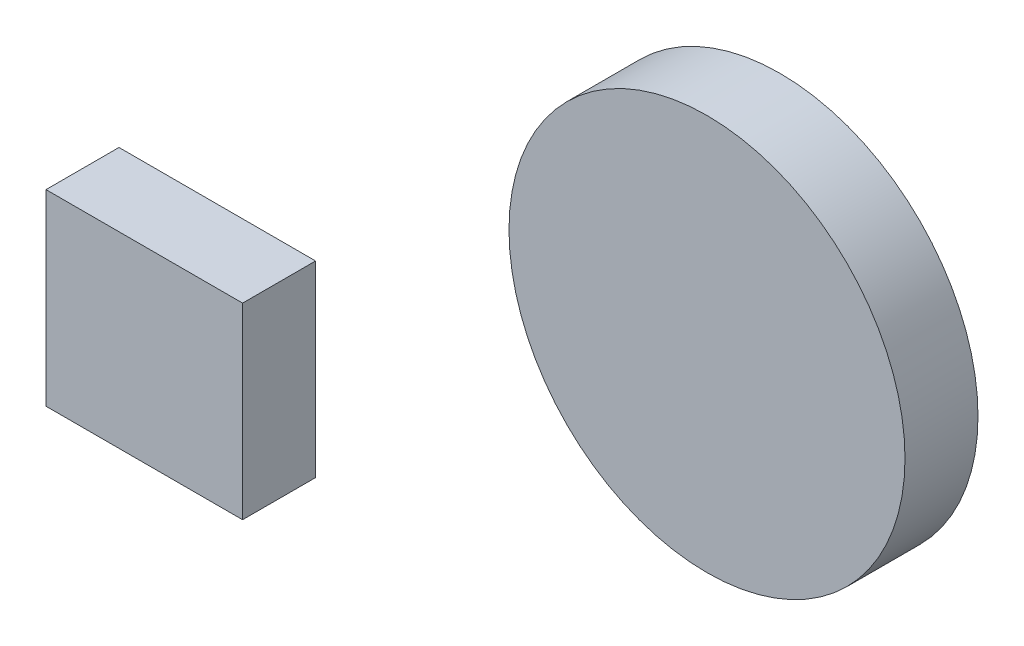
ISO-10303-21;
HEADER;
FILE_DESCRIPTION(('STEP AP214'),'2;1');
FILE_NAME('part.step','',(''),(''),'','','');
FILE_SCHEMA(('AUTOMOTIVE_DESIGN { 1 0 10303 214 1 1 1 1 }'));
ENDSEC;
DATA;
#1=APPLICATION_CONTEXT('core data for automotive mechanical design processes');
#2=APPLICATION_PROTOCOL_DEFINITION('international standard','automotive_design',2000,#1);
#3=PRODUCT_CONTEXT('',#1,'mechanical');
#4=PRODUCT('Part','Part','',(#3));
#5=PRODUCT_RELATED_PRODUCT_CATEGORY('part','',(#4));
#6=PRODUCT_DEFINITION_FORMATION('','',#4);
#7=PRODUCT_DEFINITION_CONTEXT('part definition',#1,'design');
#8=PRODUCT_DEFINITION('design','',#6,#7);
#9=PRODUCT_DEFINITION_SHAPE('','',#8);
#10=(LENGTH_UNIT() NAMED_UNIT(*) SI_UNIT(.MILLI.,.METRE.));
#11=(NAMED_UNIT(*) PLANE_ANGLE_UNIT() SI_UNIT($,.RADIAN.));
#12=(NAMED_UNIT(*) SI_UNIT($,.STERADIAN.) SOLID_ANGLE_UNIT());
#13=UNCERTAINTY_MEASURE_WITH_UNIT(LENGTH_MEASURE(1.E-05),#10,'distance_accuracy_value','');
#14=(GEOMETRIC_REPRESENTATION_CONTEXT(3) GLOBAL_UNCERTAINTY_ASSIGNED_CONTEXT((#13)) GLOBAL_UNIT_ASSIGNED_CONTEXT((#10,
#11,#12)) REPRESENTATION_CONTEXT('',''));
#15=CARTESIAN_POINT('',(0.,0.,0.));
#16=DIRECTION('',(0.,0.,1.));
#17=DIRECTION('',(1.,0.,0.));
#18=AXIS2_PLACEMENT_3D('',#15,#16,#17);
#19=CARTESIAN_POINT('',(-46.2357834757217,17.5092419138344,20.));
#20=DIRECTION('',(1.,0.,0.));
#21=DIRECTION('',(0.,0.,-1.));
#22=AXIS2_PLACEMENT_3D('',#19,#20,#21);
#23=PLANE('',#22);
#24=DIRECTION('',(0.,-1.,0.));
#25=VECTOR('',#24,1.);
#26=CARTESIAN_POINT('',(-46.2357834757217,17.5092419138344,10.));
#27=LINE('',#26,#25);
#28=CARTESIAN_POINT('',(-46.2357834757217,17.5092419138344,10.));
#29=VERTEX_POINT('',#28);
#30=CARTESIAN_POINT('',(-46.2357834757217,-8.19315679848669,10.));
#31=VERTEX_POINT('',#30);
#32=EDGE_CURVE('E110',#29,#31,#27,.T.);
#33=ORIENTED_EDGE('',*,*,#32,.T.);
#34=DIRECTION('',(0.,0.,-1.));
#35=VECTOR('',#34,1.);
#36=CARTESIAN_POINT('',(-46.2357834757217,-8.19315679848669,20.));
#37=LINE('',#36,#35);
#38=CARTESIAN_POINT('',(-46.2357834757217,-8.19315679848669,20.));
#39=VERTEX_POINT('',#38);
#40=EDGE_CURVE('E12',#39,#31,#37,.T.);
#41=ORIENTED_EDGE('',*,*,#40,.F.);
#42=DIRECTION('',(0.,-1.,0.));
#43=VECTOR('',#42,1.);
#44=CARTESIAN_POINT('',(-46.2357834757217,17.5092419138344,20.));
#45=LINE('',#44,#43);
#46=CARTESIAN_POINT('',(-46.2357834757217,17.5092419138344,20.));
#47=VERTEX_POINT('',#46);
#48=EDGE_CURVE('E98',#47,#39,#45,.T.);
#49=ORIENTED_EDGE('',*,*,#48,.F.);
#50=DIRECTION('',(0.,0.,-1.));
#51=VECTOR('',#50,1.);
#52=CARTESIAN_POINT('',(-46.2357834757217,17.5092419138344,20.));
#53=LINE('',#52,#51);
#54=EDGE_CURVE('E106',#47,#29,#53,.T.);
#55=ORIENTED_EDGE('',*,*,#54,.T.);
#56=EDGE_LOOP('',(#33,#41,#49,#55));
#57=FACE_BOUND('',#56,.T.);
#58=ADVANCED_FACE('F47',(#57),#23,.F.);
#59=CARTESIAN_POINT('',(-46.2357834757217,-8.19315679848669,20.));
#60=DIRECTION('',(0.,1.,0.));
#61=DIRECTION('',(0.,0.,1.));
#62=AXIS2_PLACEMENT_3D('',#59,#60,#61);
#63=PLANE('',#62);
#64=DIRECTION('',(1.,0.,0.));
#65=VECTOR('',#64,1.);
#66=CARTESIAN_POINT('',(-46.2357834757217,-8.19315679848669,10.));
#67=LINE('',#66,#65);
#68=CARTESIAN_POINT('',(-19.3049612955324,-8.19315679848669,10.));
#69=VERTEX_POINT('',#68);
#70=EDGE_CURVE('E102',#31,#69,#67,.T.);
#71=ORIENTED_EDGE('',*,*,#70,.T.);
#72=DIRECTION('',(0.,0.,-1.));
#73=VECTOR('',#72,1.);
#74=CARTESIAN_POINT('',(-19.3049612955324,-8.19315679848669,20.));
#75=LINE('',#74,#73);
#76=CARTESIAN_POINT('',(-19.3049612955324,-8.19315679848669,20.));
#77=VERTEX_POINT('',#76);
#78=EDGE_CURVE('E55',#77,#69,#75,.T.);
#79=ORIENTED_EDGE('',*,*,#78,.F.);
#80=DIRECTION('',(1.,0.,0.));
#81=VECTOR('',#80,1.);
#82=CARTESIAN_POINT('',(-46.2357834757217,-8.19315679848669,20.));
#83=LINE('',#82,#81);
#84=EDGE_CURVE('E93',#39,#77,#83,.T.);
#85=ORIENTED_EDGE('',*,*,#84,.F.);
#86=ORIENTED_EDGE('',*,*,#40,.T.);
#87=EDGE_LOOP('',(#71,#79,#85,#86));
#88=FACE_BOUND('',#87,.T.);
#89=ADVANCED_FACE('F101',(#88),#63,.F.);
#90=CARTESIAN_POINT('',(-19.3049612955324,17.5092419138344,20.));
#91=DIRECTION('',(-1.,0.,0.));
#92=DIRECTION('',(0.,0.,1.));
#93=AXIS2_PLACEMENT_3D('',#90,#91,#92);
#94=PLANE('',#93);
#95=DIRECTION('',(0.,1.,0.));
#96=VECTOR('',#95,1.);
#97=CARTESIAN_POINT('',(-19.3049612955324,17.5092419138344,10.));
#98=LINE('',#97,#96);
#99=CARTESIAN_POINT('',(-19.3049612955324,17.5092419138344,10.));
#100=VERTEX_POINT('',#99);
#101=EDGE_CURVE('E80',#69,#100,#98,.T.);
#102=ORIENTED_EDGE('',*,*,#101,.T.);
#103=DIRECTION('',(0.,0.,-1.));
#104=VECTOR('',#103,1.);
#105=CARTESIAN_POINT('',(-19.3049612955324,17.5092419138344,20.));
#106=LINE('',#105,#104);
#107=CARTESIAN_POINT('',(-19.3049612955324,17.5092419138344,20.));
#108=VERTEX_POINT('',#107);
#109=EDGE_CURVE('E103',#108,#100,#106,.T.);
#110=ORIENTED_EDGE('',*,*,#109,.F.);
#111=DIRECTION('',(0.,1.,0.));
#112=VECTOR('',#111,1.);
#113=CARTESIAN_POINT('',(-19.3049612955324,17.5092419138344,20.));
#114=LINE('',#113,#112);
#115=EDGE_CURVE('E96',#77,#108,#114,.T.);
#116=ORIENTED_EDGE('',*,*,#115,.F.);
#117=ORIENTED_EDGE('',*,*,#78,.T.);
#118=EDGE_LOOP('',(#102,#110,#116,#117));
#119=FACE_BOUND('',#118,.T.);
#120=ADVANCED_FACE('F104',(#119),#94,.F.);
#121=CARTESIAN_POINT('',(-46.2357834757217,17.5092419138344,20.));
#122=DIRECTION('',(0.,-1.,0.));
#123=DIRECTION('',(0.,0.,-1.));
#124=AXIS2_PLACEMENT_3D('',#121,#122,#123);
#125=PLANE('',#124);
#126=DIRECTION('',(-1.,0.,0.));
#127=VECTOR('',#126,1.);
#128=CARTESIAN_POINT('',(-46.2357834757217,17.5092419138344,10.));
#129=LINE('',#128,#127);
#130=EDGE_CURVE('E86',#100,#29,#129,.T.);
#131=ORIENTED_EDGE('',*,*,#130,.T.);
#132=ORIENTED_EDGE('',*,*,#54,.F.);
#133=DIRECTION('',(-1.,0.,0.));
#134=VECTOR('',#133,1.);
#135=CARTESIAN_POINT('',(-46.2357834757217,17.5092419138344,20.));
#136=LINE('',#135,#134);
#137=EDGE_CURVE('E63',#108,#47,#136,.T.);
#138=ORIENTED_EDGE('',*,*,#137,.F.);
#139=ORIENTED_EDGE('',*,*,#109,.T.);
#140=EDGE_LOOP('',(#131,#132,#138,#139));
#141=FACE_BOUND('',#140,.T.);
#142=ADVANCED_FACE('F117',(#141),#125,.F.);
#143=CARTESIAN_POINT('',(0.,0.,20.));
#144=DIRECTION('',(0.,0.,1.));
#145=DIRECTION('',(1.,0.,0.));
#146=AXIS2_PLACEMENT_3D('',#143,#144,#145);
#147=PLANE('',#146);
#148=ORIENTED_EDGE('',*,*,#48,.T.);
#149=ORIENTED_EDGE('',*,*,#84,.T.);
#150=ORIENTED_EDGE('',*,*,#115,.T.);
#151=ORIENTED_EDGE('',*,*,#137,.T.);
#152=EDGE_LOOP('',(#148,#149,#150,#151));
#153=FACE_BOUND('',#152,.T.);
#154=ADVANCED_FACE('F94',(#153),#147,.T.);
#155=CARTESIAN_POINT('',(0.,0.,10.));
#156=DIRECTION('',(0.,0.,1.));
#157=DIRECTION('',(1.,0.,0.));
#158=AXIS2_PLACEMENT_3D('',#155,#156,#157);
#159=PLANE('',#158);
#160=ORIENTED_EDGE('',*,*,#32,.F.);
#161=ORIENTED_EDGE('',*,*,#130,.F.);
#162=ORIENTED_EDGE('',*,*,#101,.F.);
#163=ORIENTED_EDGE('',*,*,#70,.F.);
#164=EDGE_LOOP('',(#160,#161,#162,#163));
#165=FACE_BOUND('',#164,.T.);
#166=ADVANCED_FACE('F120',(#165),#159,.F.);
#167=CLOSED_SHELL('',(#58,#89,#120,#142,#154,#166));
#168=MANIFOLD_SOLID_BREP('B2',#167);
#169=CARTESIAN_POINT('',(34.3129197926042,34.4570952924627,10.));
#170=DIRECTION('',(0.,0.,-1.));
#171=DIRECTION('',(-1.,0.,0.));
#172=AXIS2_PLACEMENT_3D('',#169,#170,#171);
#173=CYLINDRICAL_SURFACE('',#172,27.1249242696092);
#174=CARTESIAN_POINT('',(34.3129197926042,34.4570952924627,10.));
#175=DIRECTION('',(0.,0.,1.));
#176=DIRECTION('',(1.,0.,0.));
#177=AXIS2_PLACEMENT_3D('',#174,#175,#176);
#178=CIRCLE('',#177,27.1249242696092);
#179=CARTESIAN_POINT('',(61.4378440622134,34.4570952924627,10.));
#180=VERTEX_POINT('',#179);
#181=EDGE_CURVE('E46',#180,#180,#178,.T.);
#182=ORIENTED_EDGE('',*,*,#181,.F.);
#183=EDGE_LOOP('',(#182));
#184=FACE_BOUND('',#183,.T.);
#185=CARTESIAN_POINT('',(34.3129197926042,34.4570952924627,0.));
#186=DIRECTION('',(0.,0.,1.));
#187=DIRECTION('',(1.,0.,0.));
#188=AXIS2_PLACEMENT_3D('',#185,#186,#187);
#189=CIRCLE('',#188,27.1249242696092);
#190=CARTESIAN_POINT('',(61.4378440622134,34.4570952924627,0.));
#191=VERTEX_POINT('',#190);
#192=EDGE_CURVE('E186',#191,#191,#189,.T.);
#193=ORIENTED_EDGE('',*,*,#192,.T.);
#194=EDGE_LOOP('',(#193));
#195=FACE_BOUND('',#194,.T.);
#196=ADVANCED_FACE('F183',(#184,#195),#173,.T.);
#197=CARTESIAN_POINT('',(34.3129197926042,34.4570952924627,10.));
#198=DIRECTION('',(0.,0.,1.));
#199=DIRECTION('',(1.,0.,0.));
#200=AXIS2_PLACEMENT_3D('',#197,#198,#199);
#201=PLANE('',#200);
#202=ORIENTED_EDGE('',*,*,#181,.T.);
#203=EDGE_LOOP('',(#202));
#204=FACE_BOUND('',#203,.T.);
#205=ADVANCED_FACE('F198',(#204),#201,.T.);
#206=CARTESIAN_POINT('',(34.3129197926042,34.4570952924627,0.));
#207=DIRECTION('',(0.,0.,1.));
#208=DIRECTION('',(1.,0.,0.));
#209=AXIS2_PLACEMENT_3D('',#206,#207,#208);
#210=PLANE('',#209);
#211=ORIENTED_EDGE('',*,*,#192,.F.);
#212=EDGE_LOOP('',(#211));
#213=FACE_BOUND('',#212,.T.);
#214=ADVANCED_FACE('F196',(#213),#210,.F.);
#215=CLOSED_SHELL('',(#196,#205,#214));
#216=MANIFOLD_SOLID_BREP('B6',#215);
#217=ADVANCED_BREP_SHAPE_REPRESENTATION('',(#18,#168,#216),#14);
#218=SHAPE_DEFINITION_REPRESENTATION(#9,#217);
ENDSEC;
END-ISO-10303-21;
